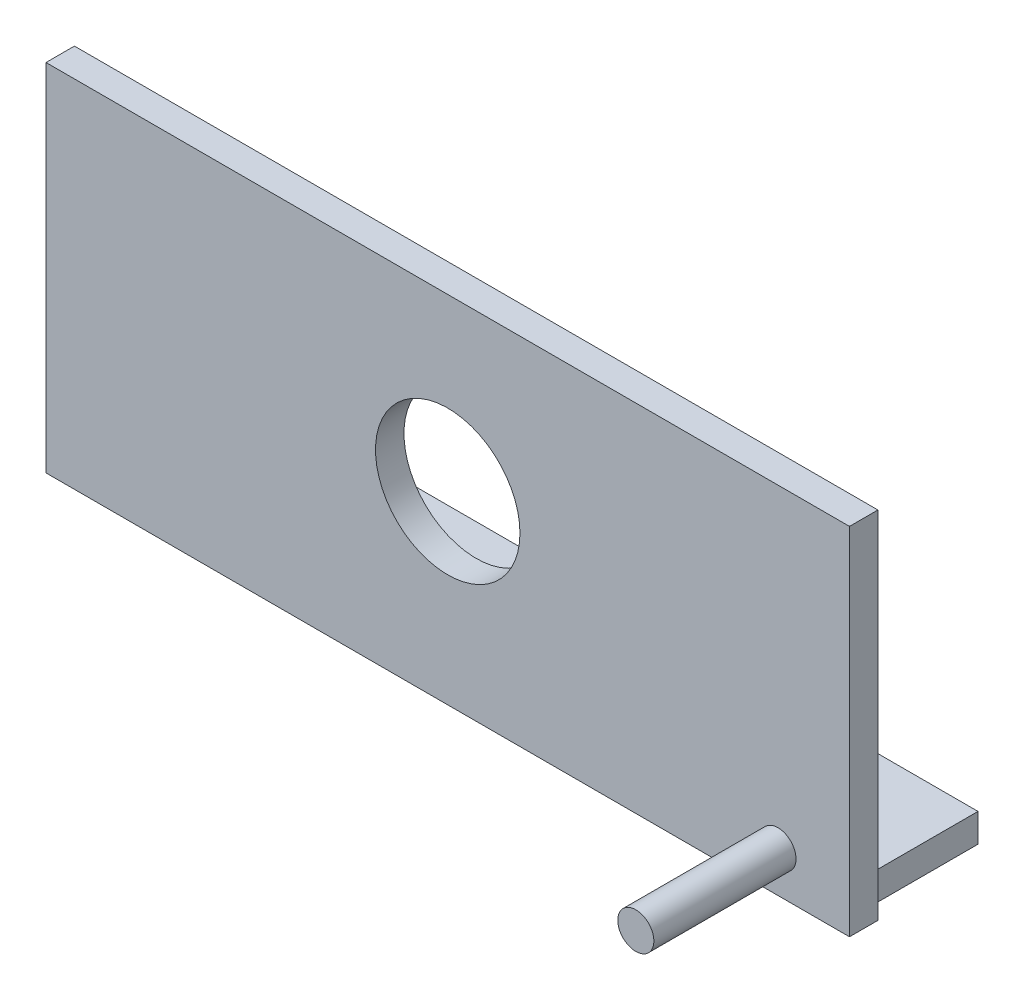
ISO-10303-21;
HEADER;
FILE_DESCRIPTION(('STEP AP214'),'2;1');
FILE_NAME('part.step','',(''),(''),'','','');
FILE_SCHEMA(('AUTOMOTIVE_DESIGN { 1 0 10303 214 1 1 1 1 }'));
ENDSEC;
DATA;
#1=APPLICATION_CONTEXT('core data for automotive mechanical design processes');
#2=APPLICATION_PROTOCOL_DEFINITION('international standard','automotive_design',2000,#1);
#3=PRODUCT_CONTEXT('',#1,'mechanical');
#4=PRODUCT('Part','Part','',(#3));
#5=PRODUCT_RELATED_PRODUCT_CATEGORY('part','',(#4));
#6=PRODUCT_DEFINITION_FORMATION('','',#4);
#7=PRODUCT_DEFINITION_CONTEXT('part definition',#1,'design');
#8=PRODUCT_DEFINITION('design','',#6,#7);
#9=PRODUCT_DEFINITION_SHAPE('','',#8);
#10=(LENGTH_UNIT() NAMED_UNIT(*) SI_UNIT(.MILLI.,.METRE.));
#11=(NAMED_UNIT(*) PLANE_ANGLE_UNIT() SI_UNIT($,.RADIAN.));
#12=(NAMED_UNIT(*) SI_UNIT($,.STERADIAN.) SOLID_ANGLE_UNIT());
#13=UNCERTAINTY_MEASURE_WITH_UNIT(LENGTH_MEASURE(1.E-05),#10,'distance_accuracy_value','');
#14=(GEOMETRIC_REPRESENTATION_CONTEXT(3) GLOBAL_UNCERTAINTY_ASSIGNED_CONTEXT((#13)) GLOBAL_UNIT_ASSIGNED_CONTEXT((#10,
#11,#12)) REPRESENTATION_CONTEXT('',''));
#15=CARTESIAN_POINT('',(0.,0.,0.));
#16=DIRECTION('',(0.,0.,1.));
#17=DIRECTION('',(1.,0.,0.));
#18=AXIS2_PLACEMENT_3D('',#15,#16,#17);
#19=CARTESIAN_POINT('',(67.8397938979355,2.49803019377464,-20.4));
#20=DIRECTION('',(1.,0.,0.));
#21=DIRECTION('',(0.,0.,-1.));
#22=AXIS2_PLACEMENT_3D('',#19,#20,#21);
#23=PLANE('',#22);
#24=DIRECTION('',(0.,0.,1.));
#25=VECTOR('',#24,1.);
#26=CARTESIAN_POINT('',(67.8397938979355,2.49803019377464,-20.4));
#27=LINE('',#26,#25);
#28=CARTESIAN_POINT('',(67.8397938979355,2.49803019377464,-20.4));
#29=VERTEX_POINT('',#28);
#30=CARTESIAN_POINT('',(67.8397938979355,2.49803019377464,0.));
#31=VERTEX_POINT('',#30);
#32=EDGE_CURVE('E162',#29,#31,#27,.T.);
#33=ORIENTED_EDGE('',*,*,#32,.T.);
#34=DIRECTION('',(0.,1.,0.));
#35=VECTOR('',#34,1.);
#36=CARTESIAN_POINT('',(67.8397938979355,-2.50196980622536,0.));
#37=LINE('',#36,#35);
#38=CARTESIAN_POINT('',(67.8397938979355,-2.50196980622536,0.));
#39=VERTEX_POINT('',#38);
#40=EDGE_CURVE('E129',#39,#31,#37,.T.);
#41=ORIENTED_EDGE('',*,*,#40,.F.);
#42=DIRECTION('',(0.,0.,1.));
#43=VECTOR('',#42,1.);
#44=CARTESIAN_POINT('',(67.8397938979355,-2.50196980622536,-20.4));
#45=LINE('',#44,#43);
#46=CARTESIAN_POINT('',(67.8397938979355,-2.50196980622536,-20.4));
#47=VERTEX_POINT('',#46);
#48=EDGE_CURVE('E165',#47,#39,#45,.T.);
#49=ORIENTED_EDGE('',*,*,#48,.F.);
#50=DIRECTION('',(0.,1.,0.));
#51=VECTOR('',#50,1.);
#52=CARTESIAN_POINT('',(67.8397938979355,2.49803019377464,-20.4));
#53=LINE('',#52,#51);
#54=EDGE_CURVE('E152',#47,#29,#53,.T.);
#55=ORIENTED_EDGE('',*,*,#54,.T.);
#56=EDGE_LOOP('',(#33,#41,#49,#55));
#57=FACE_BOUND('',#56,.T.);
#58=ADVANCED_FACE('F33',(#57),#23,.T.);
#59=CARTESIAN_POINT('',(-67.8397938979355,2.49803019377464,-20.4));
#60=DIRECTION('',(-1.,0.,0.));
#61=DIRECTION('',(0.,0.,1.));
#62=AXIS2_PLACEMENT_3D('',#59,#60,#61);
#63=PLANE('',#62);
#64=DIRECTION('',(0.,0.,1.));
#65=VECTOR('',#64,1.);
#66=CARTESIAN_POINT('',(-67.8397938979355,-2.50196980622536,-20.4));
#67=LINE('',#66,#65);
#68=CARTESIAN_POINT('',(-67.8397938979355,-2.50196980622536,-20.4));
#69=VERTEX_POINT('',#68);
#70=CARTESIAN_POINT('',(-67.8397938979355,-2.50196980622536,0.));
#71=VERTEX_POINT('',#70);
#72=EDGE_CURVE('E49',#69,#71,#67,.T.);
#73=ORIENTED_EDGE('',*,*,#72,.T.);
#74=DIRECTION('',(0.,-1.,0.));
#75=VECTOR('',#74,1.);
#76=CARTESIAN_POINT('',(-67.8397938979355,-2.50196980622536,0.));
#77=LINE('',#76,#75);
#78=CARTESIAN_POINT('',(-67.8397938979355,2.49803019377464,0.));
#79=VERTEX_POINT('',#78);
#80=EDGE_CURVE('E53',#79,#71,#77,.T.);
#81=ORIENTED_EDGE('',*,*,#80,.F.);
#82=DIRECTION('',(0.,0.,1.));
#83=VECTOR('',#82,1.);
#84=CARTESIAN_POINT('',(-67.8397938979355,2.49803019377464,-20.4));
#85=LINE('',#84,#83);
#86=CARTESIAN_POINT('',(-67.8397938979355,2.49803019377464,-20.4));
#87=VERTEX_POINT('',#86);
#88=EDGE_CURVE('E158',#87,#79,#85,.T.);
#89=ORIENTED_EDGE('',*,*,#88,.F.);
#90=DIRECTION('',(0.,-1.,0.));
#91=VECTOR('',#90,1.);
#92=CARTESIAN_POINT('',(-67.8397938979355,2.49803019377464,-20.4));
#93=LINE('',#92,#91);
#94=EDGE_CURVE('E107',#87,#69,#93,.T.);
#95=ORIENTED_EDGE('',*,*,#94,.T.);
#96=EDGE_LOOP('',(#73,#81,#89,#95));
#97=FACE_BOUND('',#96,.T.);
#98=ADVANCED_FACE('F190',(#97),#63,.T.);
#99=CARTESIAN_POINT('',(0.,0.,5.));
#100=DIRECTION('',(0.,0.,1.));
#101=DIRECTION('',(1.,0.,0.));
#102=AXIS2_PLACEMENT_3D('',#99,#100,#101);
#103=PLANE('',#102);
#104=DIRECTION('',(0.,1.,0.));
#105=VECTOR('',#104,1.);
#106=CARTESIAN_POINT('',(70.6410161513775,60.,5.));
#107=LINE('',#106,#105);
#108=CARTESIAN_POINT('',(70.6410161513775,-2.50196980622536,5.));
#109=VERTEX_POINT('',#108);
#110=CARTESIAN_POINT('',(70.6410161513775,60.,5.));
#111=VERTEX_POINT('',#110);
#112=EDGE_CURVE('E101',#109,#111,#107,.T.);
#113=ORIENTED_EDGE('',*,*,#112,.T.);
#114=DIRECTION('',(-1.,0.,0.));
#115=VECTOR('',#114,1.);
#116=CARTESIAN_POINT('',(34.6410161513775,60.,5.));
#117=LINE('',#116,#115);
#118=CARTESIAN_POINT('',(-70.6410161513775,60.,5.));
#119=VERTEX_POINT('',#118);
#120=EDGE_CURVE('E11',#111,#119,#117,.T.);
#121=ORIENTED_EDGE('',*,*,#120,.T.);
#122=DIRECTION('',(0.,-1.,0.));
#123=VECTOR('',#122,1.);
#124=CARTESIAN_POINT('',(-70.6410161513775,60.,5.));
#125=LINE('',#124,#123);
#126=CARTESIAN_POINT('',(-70.6410161513775,-2.50196980622536,5.));
#127=VERTEX_POINT('',#126);
#128=EDGE_CURVE('E103',#119,#127,#125,.T.);
#129=ORIENTED_EDGE('',*,*,#128,.T.);
#130=DIRECTION('',(1.,0.,0.));
#131=VECTOR('',#130,1.);
#132=CARTESIAN_POINT('',(-67.8397938979355,-2.50196980622536,5.));
#133=LINE('',#132,#131);
#134=EDGE_CURVE('E96',#127,#109,#133,.T.);
#135=ORIENTED_EDGE('',*,*,#134,.T.);
#136=EDGE_LOOP('',(#113,#121,#129,#135));
#137=FACE_BOUND('',#136,.T.);
#138=CARTESIAN_POINT('',(58.0697938979355,4.65803019377464,5.));
#139=DIRECTION('',(0.,0.,1.));
#140=DIRECTION('',(1.,0.,0.));
#141=AXIS2_PLACEMENT_3D('',#138,#139,#140);
#142=CIRCLE('',#141,3.175);
#143=CARTESIAN_POINT('',(61.2447938979355,4.65803019377464,5.));
#144=VERTEX_POINT('',#143);
#145=EDGE_CURVE('E138',#144,#144,#142,.T.);
#146=ORIENTED_EDGE('',*,*,#145,.F.);
#147=EDGE_LOOP('',(#146));
#148=FACE_BOUND('',#147,.T.);
#149=CARTESIAN_POINT('',(0.,30.,5.));
#150=DIRECTION('',(0.,0.,1.));
#151=DIRECTION('',(1.,0.,0.));
#152=AXIS2_PLACEMENT_3D('',#149,#150,#151);
#153=CIRCLE('',#152,12.7);
#154=CARTESIAN_POINT('',(12.7,30.,5.));
#155=VERTEX_POINT('',#154);
#156=EDGE_CURVE('E168',#155,#155,#153,.T.);
#157=ORIENTED_EDGE('',*,*,#156,.F.);
#158=EDGE_LOOP('',(#157));
#159=FACE_BOUND('',#158,.T.);
#160=ADVANCED_FACE('F98',(#137,#148,#159),#103,.T.);
#161=CARTESIAN_POINT('',(0.,0.,0.));
#162=DIRECTION('',(0.,0.,1.));
#163=DIRECTION('',(1.,0.,0.));
#164=AXIS2_PLACEMENT_3D('',#161,#162,#163);
#165=PLANE('',#164);
#166=DIRECTION('',(1.,0.,0.));
#167=VECTOR('',#166,1.);
#168=CARTESIAN_POINT('',(-67.8397938979355,2.49803019377464,0.));
#169=LINE('',#168,#167);
#170=EDGE_CURVE('E171',#79,#31,#169,.T.);
#171=ORIENTED_EDGE('',*,*,#170,.F.);
#172=ORIENTED_EDGE('',*,*,#80,.T.);
#173=DIRECTION('',(-1.,0.,0.));
#174=VECTOR('',#173,1.);
#175=CARTESIAN_POINT('',(-67.8397938979355,-2.50196980622536,0.));
#176=LINE('',#175,#174);
#177=CARTESIAN_POINT('',(-70.6410161513775,-2.50196980622536,0.));
#178=VERTEX_POINT('',#177);
#179=EDGE_CURVE('E134',#71,#178,#176,.T.);
#180=ORIENTED_EDGE('',*,*,#179,.T.);
#181=DIRECTION('',(0.,1.,0.));
#182=VECTOR('',#181,1.);
#183=CARTESIAN_POINT('',(-70.6410161513775,60.,0.));
#184=LINE('',#183,#182);
#185=CARTESIAN_POINT('',(-70.6410161513775,60.,0.));
#186=VERTEX_POINT('',#185);
#187=EDGE_CURVE('E131',#178,#186,#184,.T.);
#188=ORIENTED_EDGE('',*,*,#187,.T.);
#189=DIRECTION('',(-1.,0.,0.));
#190=VECTOR('',#189,1.);
#191=CARTESIAN_POINT('',(34.6410161513775,60.,0.));
#192=LINE('',#191,#190);
#193=CARTESIAN_POINT('',(70.6410161513775,60.,0.));
#194=VERTEX_POINT('',#193);
#195=EDGE_CURVE('E37',#194,#186,#192,.T.);
#196=ORIENTED_EDGE('',*,*,#195,.F.);
#197=DIRECTION('',(0.,-1.,0.));
#198=VECTOR('',#197,1.);
#199=CARTESIAN_POINT('',(70.6410161513775,60.,0.));
#200=LINE('',#199,#198);
#201=CARTESIAN_POINT('',(70.6410161513775,-2.50196980622536,0.));
#202=VERTEX_POINT('',#201);
#203=EDGE_CURVE('E126',#194,#202,#200,.T.);
#204=ORIENTED_EDGE('',*,*,#203,.T.);
#205=DIRECTION('',(-1.,0.,0.));
#206=VECTOR('',#205,1.);
#207=CARTESIAN_POINT('',(70.6410161513775,-2.50196980622536,0.));
#208=LINE('',#207,#206);
#209=EDGE_CURVE('E115',#202,#39,#208,.T.);
#210=ORIENTED_EDGE('',*,*,#209,.T.);
#211=ORIENTED_EDGE('',*,*,#40,.T.);
#212=EDGE_LOOP('',(#171,#172,#180,#188,#196,#204,#210,#211));
#213=FACE_BOUND('',#212,.T.);
#214=CARTESIAN_POINT('',(0.,30.,0.));
#215=DIRECTION('',(0.,0.,1.));
#216=DIRECTION('',(1.,0.,0.));
#217=AXIS2_PLACEMENT_3D('',#214,#215,#216);
#218=CIRCLE('',#217,12.7);
#219=CARTESIAN_POINT('',(12.7,30.,0.));
#220=VERTEX_POINT('',#219);
#221=EDGE_CURVE('E161',#220,#220,#218,.T.);
#222=ORIENTED_EDGE('',*,*,#221,.T.);
#223=EDGE_LOOP('',(#222));
#224=FACE_BOUND('',#223,.T.);
#225=ADVANCED_FACE('F179',(#213,#224),#165,.F.);
#226=CARTESIAN_POINT('',(34.6410161513775,60.,5.));
#227=DIRECTION('',(0.,-1.,0.));
#228=DIRECTION('',(1.,0.,0.));
#229=AXIS2_PLACEMENT_3D('',#226,#227,#228);
#230=PLANE('',#229);
#231=ORIENTED_EDGE('',*,*,#195,.T.);
#232=DIRECTION('',(0.,0.,1.));
#233=VECTOR('',#232,1.);
#234=CARTESIAN_POINT('',(-70.6410161513775,60.,-72.1283316711145));
#235=LINE('',#234,#233);
#236=EDGE_CURVE('E140',#186,#119,#235,.T.);
#237=ORIENTED_EDGE('',*,*,#236,.T.);
#238=ORIENTED_EDGE('',*,*,#120,.F.);
#239=DIRECTION('',(0.,0.,1.));
#240=VECTOR('',#239,1.);
#241=CARTESIAN_POINT('',(70.6410161513775,60.,-72.1283316711145));
#242=LINE('',#241,#240);
#243=EDGE_CURVE('E118',#194,#111,#242,.T.);
#244=ORIENTED_EDGE('',*,*,#243,.F.);
#245=EDGE_LOOP('',(#231,#237,#238,#244));
#246=FACE_BOUND('',#245,.T.);
#247=ADVANCED_FACE('F35',(#246),#230,.F.);
#248=CARTESIAN_POINT('',(0.,30.,5.));
#249=DIRECTION('',(0.,0.,-1.));
#250=DIRECTION('',(-1.,0.,0.));
#251=AXIS2_PLACEMENT_3D('',#248,#249,#250);
#252=CYLINDRICAL_SURFACE('',#251,12.7);
#253=ORIENTED_EDGE('',*,*,#156,.T.);
#254=EDGE_LOOP('',(#253));
#255=FACE_BOUND('',#254,.T.);
#256=ORIENTED_EDGE('',*,*,#221,.F.);
#257=EDGE_LOOP('',(#256));
#258=FACE_BOUND('',#257,.T.);
#259=ADVANCED_FACE('F205',(#255,#258),#252,.F.);
#260=CARTESIAN_POINT('',(-67.8397938979355,2.49803019377464,-20.4));
#261=DIRECTION('',(0.,1.,0.));
#262=DIRECTION('',(0.,0.,1.));
#263=AXIS2_PLACEMENT_3D('',#260,#261,#262);
#264=PLANE('',#263);
#265=ORIENTED_EDGE('',*,*,#88,.T.);
#266=ORIENTED_EDGE('',*,*,#170,.T.);
#267=ORIENTED_EDGE('',*,*,#32,.F.);
#268=DIRECTION('',(-1.,0.,0.));
#269=VECTOR('',#268,1.);
#270=CARTESIAN_POINT('',(-67.8397938979355,2.49803019377464,-20.4));
#271=LINE('',#270,#269);
#272=EDGE_CURVE('E155',#29,#87,#271,.T.);
#273=ORIENTED_EDGE('',*,*,#272,.T.);
#274=EDGE_LOOP('',(#265,#266,#267,#273));
#275=FACE_BOUND('',#274,.T.);
#276=ADVANCED_FACE('F191',(#275),#264,.T.);
#277=CARTESIAN_POINT('',(-67.8397938979355,-2.50196980622536,-20.4));
#278=DIRECTION('',(0.,-1.,0.));
#279=DIRECTION('',(1.,0.,0.));
#280=AXIS2_PLACEMENT_3D('',#277,#278,#279);
#281=PLANE('',#280);
#282=ORIENTED_EDGE('',*,*,#134,.F.);
#283=DIRECTION('',(0.,0.,1.));
#284=VECTOR('',#283,1.);
#285=CARTESIAN_POINT('',(-70.6410161513775,-2.50196980622536,-72.1283316711145));
#286=LINE('',#285,#284);
#287=EDGE_CURVE('E135',#178,#127,#286,.T.);
#288=ORIENTED_EDGE('',*,*,#287,.F.);
#289=ORIENTED_EDGE('',*,*,#179,.F.);
#290=ORIENTED_EDGE('',*,*,#72,.F.);
#291=DIRECTION('',(1.,0.,0.));
#292=VECTOR('',#291,1.);
#293=CARTESIAN_POINT('',(-67.8397938979355,-2.50196980622536,-20.4));
#294=LINE('',#293,#292);
#295=EDGE_CURVE('E149',#69,#47,#294,.T.);
#296=ORIENTED_EDGE('',*,*,#295,.T.);
#297=ORIENTED_EDGE('',*,*,#48,.T.);
#298=ORIENTED_EDGE('',*,*,#209,.F.);
#299=DIRECTION('',(0.,0.,1.));
#300=VECTOR('',#299,1.);
#301=CARTESIAN_POINT('',(70.6410161513775,-2.50196980622536,-72.1283316711145));
#302=LINE('',#301,#300);
#303=EDGE_CURVE('E112',#202,#109,#302,.T.);
#304=ORIENTED_EDGE('',*,*,#303,.T.);
#305=EDGE_LOOP('',(#282,#288,#289,#290,#296,#297,#298,#304));
#306=FACE_BOUND('',#305,.T.);
#307=ADVANCED_FACE('F113',(#306),#281,.T.);
#308=CARTESIAN_POINT('',(0.,0.,-20.4));
#309=DIRECTION('',(0.,0.,1.));
#310=DIRECTION('',(1.,0.,0.));
#311=AXIS2_PLACEMENT_3D('',#308,#309,#310);
#312=PLANE('',#311);
#313=ORIENTED_EDGE('',*,*,#94,.F.);
#314=ORIENTED_EDGE('',*,*,#272,.F.);
#315=ORIENTED_EDGE('',*,*,#54,.F.);
#316=ORIENTED_EDGE('',*,*,#295,.F.);
#317=EDGE_LOOP('',(#313,#314,#315,#316));
#318=FACE_BOUND('',#317,.T.);
#319=ADVANCED_FACE('F188',(#318),#312,.F.);
#320=CARTESIAN_POINT('',(58.0697938979355,4.65803019377464,30.));
#321=DIRECTION('',(0.,0.,-1.));
#322=DIRECTION('',(-1.,0.,0.));
#323=AXIS2_PLACEMENT_3D('',#320,#321,#322);
#324=CYLINDRICAL_SURFACE('',#323,3.175);
#325=CARTESIAN_POINT('',(58.0697938979355,4.65803019377464,30.));
#326=DIRECTION('',(0.,0.,1.));
#327=DIRECTION('',(1.,0.,0.));
#328=AXIS2_PLACEMENT_3D('',#325,#326,#327);
#329=CIRCLE('',#328,3.175);
#330=CARTESIAN_POINT('',(61.2447938979355,4.65803019377464,30.));
#331=VERTEX_POINT('',#330);
#332=EDGE_CURVE('E108',#331,#331,#329,.T.);
#333=ORIENTED_EDGE('',*,*,#332,.F.);
#334=EDGE_LOOP('',(#333));
#335=FACE_BOUND('',#334,.T.);
#336=ORIENTED_EDGE('',*,*,#145,.T.);
#337=EDGE_LOOP('',(#336));
#338=FACE_BOUND('',#337,.T.);
#339=ADVANCED_FACE('F236',(#335,#338),#324,.T.);
#340=CARTESIAN_POINT('',(58.0697938979355,4.65803019377464,30.));
#341=DIRECTION('',(0.,0.,1.));
#342=DIRECTION('',(1.,0.,0.));
#343=AXIS2_PLACEMENT_3D('',#340,#341,#342);
#344=PLANE('',#343);
#345=ORIENTED_EDGE('',*,*,#332,.T.);
#346=EDGE_LOOP('',(#345));
#347=FACE_BOUND('',#346,.T.);
#348=ADVANCED_FACE('F242',(#347),#344,.T.);
#349=CARTESIAN_POINT('',(-70.6410161513775,60.,-72.1283316711145));
#350=DIRECTION('',(-1.,0.,0.));
#351=DIRECTION('',(0.,0.,1.));
#352=AXIS2_PLACEMENT_3D('',#349,#350,#351);
#353=PLANE('',#352);
#354=ORIENTED_EDGE('',*,*,#187,.F.);
#355=ORIENTED_EDGE('',*,*,#287,.T.);
#356=ORIENTED_EDGE('',*,*,#128,.F.);
#357=ORIENTED_EDGE('',*,*,#236,.F.);
#358=EDGE_LOOP('',(#354,#355,#356,#357));
#359=FACE_BOUND('',#358,.T.);
#360=ADVANCED_FACE('F183',(#359),#353,.T.);
#361=CARTESIAN_POINT('',(70.6410161513775,60.,-72.1283316711145));
#362=DIRECTION('',(1.,0.,0.));
#363=DIRECTION('',(0.,0.,-1.));
#364=AXIS2_PLACEMENT_3D('',#361,#362,#363);
#365=PLANE('',#364);
#366=ORIENTED_EDGE('',*,*,#203,.F.);
#367=ORIENTED_EDGE('',*,*,#243,.T.);
#368=ORIENTED_EDGE('',*,*,#112,.F.);
#369=ORIENTED_EDGE('',*,*,#303,.F.);
#370=EDGE_LOOP('',(#366,#367,#368,#369));
#371=FACE_BOUND('',#370,.T.);
#372=ADVANCED_FACE('F121',(#371),#365,.T.);
#373=CLOSED_SHELL('',(#58,#98,#160,#225,#247,#259,#276,#307,#319,#339,#348,#360,#372));
#374=MANIFOLD_SOLID_BREP('B2',#373);
#375=ADVANCED_BREP_SHAPE_REPRESENTATION('',(#18,#374),#14);
#376=SHAPE_DEFINITION_REPRESENTATION(#9,#375);
ENDSEC;
END-ISO-10303-21;
